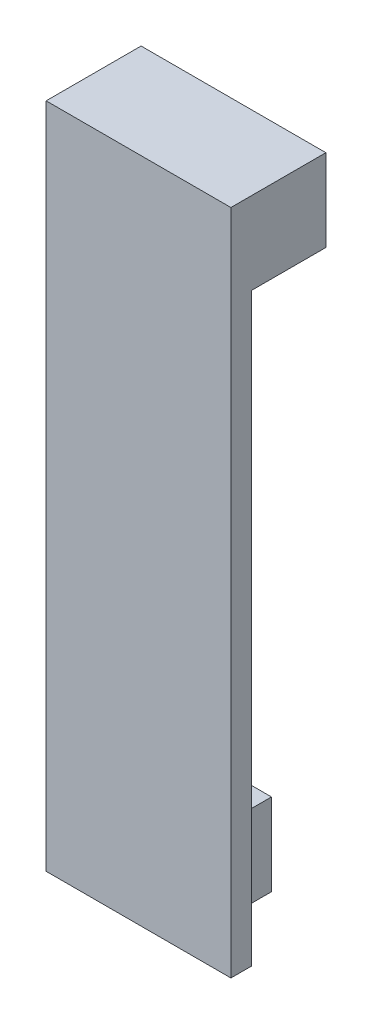
ISO-10303-21;
HEADER;
FILE_DESCRIPTION(('STEP AP214'),'2;1');
FILE_NAME('part.step','',(''),(''),'','','');
FILE_SCHEMA(('AUTOMOTIVE_DESIGN { 1 0 10303 214 1 1 1 1 }'));
ENDSEC;
DATA;
#1=APPLICATION_CONTEXT('core data for automotive mechanical design processes');
#2=APPLICATION_PROTOCOL_DEFINITION('international standard','automotive_design',2000,#1);
#3=PRODUCT_CONTEXT('',#1,'mechanical');
#4=PRODUCT('Part','Part','',(#3));
#5=PRODUCT_RELATED_PRODUCT_CATEGORY('part','',(#4));
#6=PRODUCT_DEFINITION_FORMATION('','',#4);
#7=PRODUCT_DEFINITION_CONTEXT('part definition',#1,'design');
#8=PRODUCT_DEFINITION('design','',#6,#7);
#9=PRODUCT_DEFINITION_SHAPE('','',#8);
#10=(LENGTH_UNIT() NAMED_UNIT(*) SI_UNIT(.MILLI.,.METRE.));
#11=(NAMED_UNIT(*) PLANE_ANGLE_UNIT() SI_UNIT($,.RADIAN.));
#12=(NAMED_UNIT(*) SI_UNIT($,.STERADIAN.) SOLID_ANGLE_UNIT());
#13=UNCERTAINTY_MEASURE_WITH_UNIT(LENGTH_MEASURE(1.E-05),#10,'distance_accuracy_value','');
#14=(GEOMETRIC_REPRESENTATION_CONTEXT(3) GLOBAL_UNCERTAINTY_ASSIGNED_CONTEXT((#13)) GLOBAL_UNIT_ASSIGNED_CONTEXT((#10,
#11,#12)) REPRESENTATION_CONTEXT('',''));
#15=CARTESIAN_POINT('',(0.,0.,0.));
#16=DIRECTION('',(0.,0.,1.));
#17=DIRECTION('',(1.,0.,0.));
#18=AXIS2_PLACEMENT_3D('',#15,#16,#17);
#19=CARTESIAN_POINT('',(0.,0.,0.));
#20=DIRECTION('',(0.,0.,-1.));
#21=DIRECTION('',(-1.,0.,0.));
#22=AXIS2_PLACEMENT_3D('',#19,#20,#21);
#23=PLANE('',#22);
#24=DIRECTION('',(0.,-1.,0.));
#25=VECTOR('',#24,1.);
#26=CARTESIAN_POINT('',(-9.,-32.5,0.));
#27=LINE('',#26,#25);
#28=CARTESIAN_POINT('',(-9.,24.5,0.));
#29=VERTEX_POINT('',#28);
#30=CARTESIAN_POINT('',(-9.,-32.5,0.));
#31=VERTEX_POINT('',#30);
#32=EDGE_CURVE('E342',#29,#31,#27,.T.);
#33=ORIENTED_EDGE('',*,*,#32,.F.);
#34=DIRECTION('',(-1.,0.,0.));
#35=VECTOR('',#34,1.);
#36=CARTESIAN_POINT('',(9.,24.5,0.));
#37=LINE('',#36,#35);
#38=CARTESIAN_POINT('',(9.,24.5,0.));
#39=VERTEX_POINT('',#38);
#40=EDGE_CURVE('E188',#39,#29,#37,.T.);
#41=ORIENTED_EDGE('',*,*,#40,.F.);
#42=DIRECTION('',(0.,1.,0.));
#43=VECTOR('',#42,1.);
#44=CARTESIAN_POINT('',(9.,-32.5,0.));
#45=LINE('',#44,#43);
#46=CARTESIAN_POINT('',(9.,-32.5,0.));
#47=VERTEX_POINT('',#46);
#48=EDGE_CURVE('E193',#47,#39,#45,.T.);
#49=ORIENTED_EDGE('',*,*,#48,.F.);
#50=DIRECTION('',(1.,0.,0.));
#51=VECTOR('',#50,1.);
#52=CARTESIAN_POINT('',(-9.,-32.5,0.));
#53=LINE('',#52,#51);
#54=CARTESIAN_POINT('',(3.7,-32.5,0.));
#55=VERTEX_POINT('',#54);
#56=EDGE_CURVE('E345',#55,#47,#53,.T.);
#57=ORIENTED_EDGE('',*,*,#56,.F.);
#58=DIRECTION('',(0.,-1.,0.));
#59=VECTOR('',#58,1.);
#60=CARTESIAN_POINT('',(3.7,-32.5,0.));
#61=LINE('',#60,#59);
#62=CARTESIAN_POINT('',(3.7,-24.5,0.));
#63=VERTEX_POINT('',#62);
#64=EDGE_CURVE('E238',#63,#55,#61,.T.);
#65=ORIENTED_EDGE('',*,*,#64,.F.);
#66=DIRECTION('',(1.,0.,0.));
#67=VECTOR('',#66,1.);
#68=CARTESIAN_POINT('',(3.7,-24.5,0.));
#69=LINE('',#68,#67);
#70=CARTESIAN_POINT('',(-3.7,-24.5,0.));
#71=VERTEX_POINT('',#70);
#72=EDGE_CURVE('E290',#71,#63,#69,.T.);
#73=ORIENTED_EDGE('',*,*,#72,.F.);
#74=DIRECTION('',(0.,1.,0.));
#75=VECTOR('',#74,1.);
#76=CARTESIAN_POINT('',(-3.7,-32.5,0.));
#77=LINE('',#76,#75);
#78=CARTESIAN_POINT('',(-3.7,-32.5,0.));
#79=VERTEX_POINT('',#78);
#80=EDGE_CURVE('E303',#79,#71,#77,.T.);
#81=ORIENTED_EDGE('',*,*,#80,.F.);
#82=EDGE_CURVE('E330',#31,#79,#53,.T.);
#83=ORIENTED_EDGE('',*,*,#82,.F.);
#84=EDGE_LOOP('',(#33,#41,#49,#57,#65,#73,#81,#83));
#85=FACE_BOUND('',#84,.T.);
#86=ADVANCED_FACE('F41',(#85),#23,.T.);
#87=CARTESIAN_POINT('',(9.,-32.5,2.));
#88=DIRECTION('',(-1.,0.,0.));
#89=DIRECTION('',(0.,0.,1.));
#90=AXIS2_PLACEMENT_3D('',#87,#88,#89);
#91=PLANE('',#90);
#92=ORIENTED_EDGE('',*,*,#48,.T.);
#93=DIRECTION('',(0.,0.,1.));
#94=VECTOR('',#93,1.);
#95=CARTESIAN_POINT('',(9.,24.5,-7.25));
#96=LINE('',#95,#94);
#97=CARTESIAN_POINT('',(9.,24.5,-7.25));
#98=VERTEX_POINT('',#97);
#99=EDGE_CURVE('E169',#98,#39,#96,.T.);
#100=ORIENTED_EDGE('',*,*,#99,.F.);
#101=DIRECTION('',(0.,-1.,0.));
#102=VECTOR('',#101,1.);
#103=CARTESIAN_POINT('',(9.,32.5,-7.25));
#104=LINE('',#103,#102);
#105=CARTESIAN_POINT('',(9.,32.5,-7.25));
#106=VERTEX_POINT('',#105);
#107=EDGE_CURVE('E178',#106,#98,#104,.T.);
#108=ORIENTED_EDGE('',*,*,#107,.F.);
#109=DIRECTION('',(0.,0.,-1.));
#110=VECTOR('',#109,1.);
#111=CARTESIAN_POINT('',(9.,32.5,2.));
#112=LINE('',#111,#110);
#113=CARTESIAN_POINT('',(9.,32.5,2.));
#114=VERTEX_POINT('',#113);
#115=EDGE_CURVE('E11',#114,#106,#112,.T.);
#116=ORIENTED_EDGE('',*,*,#115,.F.);
#117=DIRECTION('',(0.,1.,0.));
#118=VECTOR('',#117,1.);
#119=CARTESIAN_POINT('',(9.,-32.5,2.));
#120=LINE('',#119,#118);
#121=CARTESIAN_POINT('',(9.,-32.5,2.));
#122=VERTEX_POINT('',#121);
#123=EDGE_CURVE('E325',#122,#114,#120,.T.);
#124=ORIENTED_EDGE('',*,*,#123,.F.);
#125=DIRECTION('',(0.,0.,-1.));
#126=VECTOR('',#125,1.);
#127=CARTESIAN_POINT('',(9.,-32.5,2.));
#128=LINE('',#127,#126);
#129=EDGE_CURVE('E339',#122,#47,#128,.T.);
#130=ORIENTED_EDGE('',*,*,#129,.T.);
#131=EDGE_LOOP('',(#92,#100,#108,#116,#124,#130));
#132=FACE_BOUND('',#131,.T.);
#133=ADVANCED_FACE('F43',(#132),#91,.F.);
#134=CARTESIAN_POINT('',(-9.,32.5,2.));
#135=DIRECTION('',(0.,-1.,0.));
#136=DIRECTION('',(0.,0.,-1.));
#137=AXIS2_PLACEMENT_3D('',#134,#135,#136);
#138=PLANE('',#137);
#139=ORIENTED_EDGE('',*,*,#115,.T.);
#140=DIRECTION('',(1.,0.,0.));
#141=VECTOR('',#140,1.);
#142=CARTESIAN_POINT('',(9.,32.5,-7.25));
#143=LINE('',#142,#141);
#144=CARTESIAN_POINT('',(-9.,32.5,-7.25));
#145=VERTEX_POINT('',#144);
#146=EDGE_CURVE('E184',#145,#106,#143,.T.);
#147=ORIENTED_EDGE('',*,*,#146,.F.);
#148=DIRECTION('',(0.,0.,-1.));
#149=VECTOR('',#148,1.);
#150=CARTESIAN_POINT('',(-9.,32.5,2.));
#151=LINE('',#150,#149);
#152=CARTESIAN_POINT('',(-9.,32.5,2.));
#153=VERTEX_POINT('',#152);
#154=EDGE_CURVE('E50',#153,#145,#151,.T.);
#155=ORIENTED_EDGE('',*,*,#154,.F.);
#156=DIRECTION('',(-1.,0.,0.));
#157=VECTOR('',#156,1.);
#158=CARTESIAN_POINT('',(-9.,32.5,2.));
#159=LINE('',#158,#157);
#160=EDGE_CURVE('E329',#114,#153,#159,.T.);
#161=ORIENTED_EDGE('',*,*,#160,.F.);
#162=EDGE_LOOP('',(#139,#147,#155,#161));
#163=FACE_BOUND('',#162,.T.);
#164=ADVANCED_FACE('F363',(#163),#138,.F.);
#165=CARTESIAN_POINT('',(-9.,-32.5,2.));
#166=DIRECTION('',(1.,0.,0.));
#167=DIRECTION('',(0.,0.,-1.));
#168=AXIS2_PLACEMENT_3D('',#165,#166,#167);
#169=PLANE('',#168);
#170=ORIENTED_EDGE('',*,*,#154,.T.);
#171=DIRECTION('',(0.,1.,0.));
#172=VECTOR('',#171,1.);
#173=CARTESIAN_POINT('',(-9.,32.5,-7.25));
#174=LINE('',#173,#172);
#175=CARTESIAN_POINT('',(-9.,24.5,-7.25));
#176=VERTEX_POINT('',#175);
#177=EDGE_CURVE('E177',#176,#145,#174,.T.);
#178=ORIENTED_EDGE('',*,*,#177,.F.);
#179=DIRECTION('',(0.,0.,1.));
#180=VECTOR('',#179,1.);
#181=CARTESIAN_POINT('',(-9.,24.5,-7.25));
#182=LINE('',#181,#180);
#183=EDGE_CURVE('E172',#176,#29,#182,.T.);
#184=ORIENTED_EDGE('',*,*,#183,.T.);
#185=ORIENTED_EDGE('',*,*,#32,.T.);
#186=DIRECTION('',(0.,0.,-1.));
#187=VECTOR('',#186,1.);
#188=CARTESIAN_POINT('',(-9.,-32.5,2.));
#189=LINE('',#188,#187);
#190=CARTESIAN_POINT('',(-9.,-32.5,2.));
#191=VERTEX_POINT('',#190);
#192=EDGE_CURVE('E351',#191,#31,#189,.T.);
#193=ORIENTED_EDGE('',*,*,#192,.F.);
#194=DIRECTION('',(0.,-1.,0.));
#195=VECTOR('',#194,1.);
#196=CARTESIAN_POINT('',(-9.,-32.5,2.));
#197=LINE('',#196,#195);
#198=EDGE_CURVE('E333',#153,#191,#197,.T.);
#199=ORIENTED_EDGE('',*,*,#198,.F.);
#200=EDGE_LOOP('',(#170,#178,#184,#185,#193,#199));
#201=FACE_BOUND('',#200,.T.);
#202=ADVANCED_FACE('F358',(#201),#169,.F.);
#203=CARTESIAN_POINT('',(-9.,-32.5,2.));
#204=DIRECTION('',(0.,1.,0.));
#205=DIRECTION('',(0.,0.,1.));
#206=AXIS2_PLACEMENT_3D('',#203,#204,#205);
#207=PLANE('',#206);
#208=DIRECTION('',(1.,0.,0.));
#209=VECTOR('',#208,1.);
#210=CARTESIAN_POINT('',(-3.2,-32.5,-5.75));
#211=LINE('',#210,#209);
#212=CARTESIAN_POINT('',(-3.2,-32.5,-5.75));
#213=VERTEX_POINT('',#212);
#214=CARTESIAN_POINT('',(-0.199999999999999,-32.5,-5.75));
#215=VERTEX_POINT('',#214);
#216=EDGE_CURVE('E223',#213,#215,#211,.T.);
#217=ORIENTED_EDGE('',*,*,#216,.F.);
#218=DIRECTION('',(0.,0.,-1.));
#219=VECTOR('',#218,1.);
#220=CARTESIAN_POINT('',(-3.2,-32.5,-1.25));
#221=LINE('',#220,#219);
#222=CARTESIAN_POINT('',(-3.2,-32.5,-1.25));
#223=VERTEX_POINT('',#222);
#224=EDGE_CURVE('E57',#223,#213,#221,.T.);
#225=ORIENTED_EDGE('',*,*,#224,.F.);
#226=DIRECTION('',(-1.,0.,0.));
#227=VECTOR('',#226,1.);
#228=CARTESIAN_POINT('',(-3.2,-32.5,-1.25));
#229=LINE('',#228,#227);
#230=CARTESIAN_POINT('',(-0.2,-32.5,-1.25));
#231=VERTEX_POINT('',#230);
#232=EDGE_CURVE('E208',#231,#223,#229,.T.);
#233=ORIENTED_EDGE('',*,*,#232,.F.);
#234=DIRECTION('',(0.,0.,1.));
#235=VECTOR('',#234,1.);
#236=CARTESIAN_POINT('',(-0.2,-32.5,-1.25));
#237=LINE('',#236,#235);
#238=EDGE_CURVE('E228',#215,#231,#237,.T.);
#239=ORIENTED_EDGE('',*,*,#238,.F.);
#240=EDGE_LOOP('',(#217,#225,#233,#239));
#241=FACE_BOUND('',#240,.T.);
#242=DIRECTION('',(1.,0.,0.));
#243=VECTOR('',#242,1.);
#244=CARTESIAN_POINT('',(0.2,-32.5,-5.75));
#245=LINE('',#244,#243);
#246=CARTESIAN_POINT('',(0.200000000000001,-32.5,-5.75));
#247=VERTEX_POINT('',#246);
#248=CARTESIAN_POINT('',(3.2,-32.5,-5.75));
#249=VERTEX_POINT('',#248);
#250=EDGE_CURVE('E198',#247,#249,#245,.T.);
#251=ORIENTED_EDGE('',*,*,#250,.F.);
#252=DIRECTION('',(0.,0.,-1.));
#253=VECTOR('',#252,1.);
#254=CARTESIAN_POINT('',(0.2,-32.5,-1.25));
#255=LINE('',#254,#253);
#256=CARTESIAN_POINT('',(0.2,-32.5,-1.25));
#257=VERTEX_POINT('',#256);
#258=EDGE_CURVE('E65',#257,#247,#255,.T.);
#259=ORIENTED_EDGE('',*,*,#258,.F.);
#260=DIRECTION('',(-1.,0.,0.));
#261=VECTOR('',#260,1.);
#262=CARTESIAN_POINT('',(0.2,-32.5,-1.25));
#263=LINE('',#262,#261);
#264=CARTESIAN_POINT('',(3.2,-32.5,-1.25));
#265=VERTEX_POINT('',#264);
#266=EDGE_CURVE('E252',#265,#257,#263,.T.);
#267=ORIENTED_EDGE('',*,*,#266,.F.);
#268=DIRECTION('',(0.,0.,1.));
#269=VECTOR('',#268,1.);
#270=CARTESIAN_POINT('',(3.2,-32.5,-1.25));
#271=LINE('',#270,#269);
#272=EDGE_CURVE('E268',#249,#265,#271,.T.);
#273=ORIENTED_EDGE('',*,*,#272,.F.);
#274=EDGE_LOOP('',(#251,#259,#267,#273));
#275=FACE_BOUND('',#274,.T.);
#276=ORIENTED_EDGE('',*,*,#82,.T.);
#277=DIRECTION('',(0.,0.,1.));
#278=VECTOR('',#277,1.);
#279=CARTESIAN_POINT('',(-3.7,-32.5,-7.25));
#280=LINE('',#279,#278);
#281=CARTESIAN_POINT('',(-3.7,-32.5,-7.25));
#282=VERTEX_POINT('',#281);
#283=EDGE_CURVE('E317',#282,#79,#280,.T.);
#284=ORIENTED_EDGE('',*,*,#283,.F.);
#285=DIRECTION('',(-1.,0.,0.));
#286=VECTOR('',#285,1.);
#287=CARTESIAN_POINT('',(3.7,-32.5,-7.25));
#288=LINE('',#287,#286);
#289=CARTESIAN_POINT('',(3.7,-32.5,-7.25));
#290=VERTEX_POINT('',#289);
#291=EDGE_CURVE('E289',#290,#282,#288,.T.);
#292=ORIENTED_EDGE('',*,*,#291,.F.);
#293=DIRECTION('',(0.,0.,1.));
#294=VECTOR('',#293,1.);
#295=CARTESIAN_POINT('',(3.7,-32.5,-7.25));
#296=LINE('',#295,#294);
#297=EDGE_CURVE('E321',#290,#55,#296,.T.);
#298=ORIENTED_EDGE('',*,*,#297,.T.);
#299=ORIENTED_EDGE('',*,*,#56,.T.);
#300=ORIENTED_EDGE('',*,*,#129,.F.);
#301=DIRECTION('',(1.,0.,0.));
#302=VECTOR('',#301,1.);
#303=CARTESIAN_POINT('',(-9.,-32.5,2.));
#304=LINE('',#303,#302);
#305=EDGE_CURVE('E336',#191,#122,#304,.T.);
#306=ORIENTED_EDGE('',*,*,#305,.F.);
#307=ORIENTED_EDGE('',*,*,#192,.T.);
#308=EDGE_LOOP('',(#276,#284,#292,#298,#299,#300,#306,#307));
#309=FACE_BOUND('',#308,.T.);
#310=ADVANCED_FACE('F372',(#241,#275,#309),#207,.F.);
#311=CARTESIAN_POINT('',(0.,0.,2.));
#312=DIRECTION('',(0.,0.,-1.));
#313=DIRECTION('',(-1.,0.,0.));
#314=AXIS2_PLACEMENT_3D('',#311,#312,#313);
#315=PLANE('',#314);
#316=ORIENTED_EDGE('',*,*,#123,.T.);
#317=ORIENTED_EDGE('',*,*,#160,.T.);
#318=ORIENTED_EDGE('',*,*,#198,.T.);
#319=ORIENTED_EDGE('',*,*,#305,.T.);
#320=EDGE_LOOP('',(#316,#317,#318,#319));
#321=FACE_BOUND('',#320,.T.);
#322=ADVANCED_FACE('F405',(#321),#315,.F.);
#323=CARTESIAN_POINT('',(3.7,-32.5,-7.25));
#324=DIRECTION('',(-1.,0.,0.));
#325=DIRECTION('',(0.,-1.,0.));
#326=AXIS2_PLACEMENT_3D('',#323,#324,#325);
#327=PLANE('',#326);
#328=ORIENTED_EDGE('',*,*,#64,.T.);
#329=ORIENTED_EDGE('',*,*,#297,.F.);
#330=DIRECTION('',(0.,-1.,0.));
#331=VECTOR('',#330,1.);
#332=CARTESIAN_POINT('',(3.7,-32.5,-7.25));
#333=LINE('',#332,#331);
#334=CARTESIAN_POINT('',(3.7,-24.5,-7.25));
#335=VERTEX_POINT('',#334);
#336=EDGE_CURVE('E285',#335,#290,#333,.T.);
#337=ORIENTED_EDGE('',*,*,#336,.F.);
#338=DIRECTION('',(0.,0.,1.));
#339=VECTOR('',#338,1.);
#340=CARTESIAN_POINT('',(3.7,-24.5,-7.25));
#341=LINE('',#340,#339);
#342=EDGE_CURVE('E299',#335,#63,#341,.T.);
#343=ORIENTED_EDGE('',*,*,#342,.T.);
#344=EDGE_LOOP('',(#328,#329,#337,#343));
#345=FACE_BOUND('',#344,.T.);
#346=ADVANCED_FACE('F386',(#345),#327,.F.);
#347=CARTESIAN_POINT('',(-3.7,-32.5,-7.25));
#348=DIRECTION('',(1.,0.,0.));
#349=DIRECTION('',(0.,0.,-1.));
#350=AXIS2_PLACEMENT_3D('',#347,#348,#349);
#351=PLANE('',#350);
#352=ORIENTED_EDGE('',*,*,#80,.T.);
#353=DIRECTION('',(0.,0.,1.));
#354=VECTOR('',#353,1.);
#355=CARTESIAN_POINT('',(-3.7,-24.5,-7.25));
#356=LINE('',#355,#354);
#357=CARTESIAN_POINT('',(-3.7,-24.5,-7.25));
#358=VERTEX_POINT('',#357);
#359=EDGE_CURVE('E313',#358,#71,#356,.T.);
#360=ORIENTED_EDGE('',*,*,#359,.F.);
#361=DIRECTION('',(0.,1.,0.));
#362=VECTOR('',#361,1.);
#363=CARTESIAN_POINT('',(-3.7,-32.5,-7.25));
#364=LINE('',#363,#362);
#365=EDGE_CURVE('E293',#282,#358,#364,.T.);
#366=ORIENTED_EDGE('',*,*,#365,.F.);
#367=ORIENTED_EDGE('',*,*,#283,.T.);
#368=EDGE_LOOP('',(#352,#360,#366,#367));
#369=FACE_BOUND('',#368,.T.);
#370=ADVANCED_FACE('F376',(#369),#351,.F.);
#371=CARTESIAN_POINT('',(3.7,-24.5,-7.25));
#372=DIRECTION('',(0.,-1.,0.));
#373=DIRECTION('',(0.,0.,-1.));
#374=AXIS2_PLACEMENT_3D('',#371,#372,#373);
#375=PLANE('',#374);
#376=ORIENTED_EDGE('',*,*,#72,.T.);
#377=ORIENTED_EDGE('',*,*,#342,.F.);
#378=DIRECTION('',(1.,0.,0.));
#379=VECTOR('',#378,1.);
#380=CARTESIAN_POINT('',(3.7,-24.5,-7.25));
#381=LINE('',#380,#379);
#382=EDGE_CURVE('E296',#358,#335,#381,.T.);
#383=ORIENTED_EDGE('',*,*,#382,.F.);
#384=ORIENTED_EDGE('',*,*,#359,.T.);
#385=EDGE_LOOP('',(#376,#377,#383,#384));
#386=FACE_BOUND('',#385,.T.);
#387=ADVANCED_FACE('F388',(#386),#375,.F.);
#388=CARTESIAN_POINT('',(0.,0.,-7.25));
#389=DIRECTION('',(0.,0.,1.));
#390=DIRECTION('',(1.,0.,0.));
#391=AXIS2_PLACEMENT_3D('',#388,#389,#390);
#392=PLANE('',#391);
#393=ORIENTED_EDGE('',*,*,#336,.T.);
#394=ORIENTED_EDGE('',*,*,#291,.T.);
#395=ORIENTED_EDGE('',*,*,#365,.T.);
#396=ORIENTED_EDGE('',*,*,#382,.T.);
#397=EDGE_LOOP('',(#393,#394,#395,#396));
#398=FACE_BOUND('',#397,.T.);
#399=ADVANCED_FACE('F380',(#398),#392,.F.);
#400=CARTESIAN_POINT('',(0.2,-27.5,-1.25));
#401=DIRECTION('',(-1.,0.,0.));
#402=DIRECTION('',(0.,0.,1.));
#403=AXIS2_PLACEMENT_3D('',#400,#401,#402);
#404=PLANE('',#403);
#405=ORIENTED_EDGE('',*,*,#258,.T.);
#406=DIRECTION('',(0.,-1.,0.));
#407=VECTOR('',#406,1.);
#408=CARTESIAN_POINT('',(0.2,-27.5,-5.75));
#409=LINE('',#408,#407);
#410=CARTESIAN_POINT('',(0.2,-27.5,-5.75));
#411=VERTEX_POINT('',#410);
#412=EDGE_CURVE('E263',#411,#247,#409,.T.);
#413=ORIENTED_EDGE('',*,*,#412,.F.);
#414=DIRECTION('',(0.,0.,-1.));
#415=VECTOR('',#414,1.);
#416=CARTESIAN_POINT('',(0.2,-27.5,-1.25));
#417=LINE('',#416,#415);
#418=CARTESIAN_POINT('',(0.2,-27.5,-1.25));
#419=VERTEX_POINT('',#418);
#420=EDGE_CURVE('E247',#419,#411,#417,.T.);
#421=ORIENTED_EDGE('',*,*,#420,.F.);
#422=DIRECTION('',(0.,-1.,0.));
#423=VECTOR('',#422,1.);
#424=CARTESIAN_POINT('',(0.2,-27.5,-1.25));
#425=LINE('',#424,#423);
#426=EDGE_CURVE('E224',#419,#257,#425,.T.);
#427=ORIENTED_EDGE('',*,*,#426,.T.);
#428=EDGE_LOOP('',(#405,#413,#421,#427));
#429=FACE_BOUND('',#428,.T.);
#430=ADVANCED_FACE('F395',(#429),#404,.F.);
#431=CARTESIAN_POINT('',(0.2,-27.5,-1.25));
#432=DIRECTION('',(0.,0.,1.));
#433=DIRECTION('',(1.,0.,0.));
#434=AXIS2_PLACEMENT_3D('',#431,#432,#433);
#435=PLANE('',#434);
#436=ORIENTED_EDGE('',*,*,#266,.T.);
#437=ORIENTED_EDGE('',*,*,#426,.F.);
#438=DIRECTION('',(-1.,0.,0.));
#439=VECTOR('',#438,1.);
#440=CARTESIAN_POINT('',(0.2,-27.5,-1.25));
#441=LINE('',#440,#439);
#442=CARTESIAN_POINT('',(3.2,-27.5,-1.25));
#443=VERTEX_POINT('',#442);
#444=EDGE_CURVE('E260',#443,#419,#441,.T.);
#445=ORIENTED_EDGE('',*,*,#444,.F.);
#446=DIRECTION('',(0.,-1.,0.));
#447=VECTOR('',#446,1.);
#448=CARTESIAN_POINT('',(3.2,-27.5,-1.25));
#449=LINE('',#448,#447);
#450=EDGE_CURVE('E277',#443,#265,#449,.T.);
#451=ORIENTED_EDGE('',*,*,#450,.T.);
#452=EDGE_LOOP('',(#436,#437,#445,#451));
#453=FACE_BOUND('',#452,.T.);
#454=ADVANCED_FACE('F513',(#453),#435,.F.);
#455=CARTESIAN_POINT('',(3.2,-27.5,-1.25));
#456=DIRECTION('',(1.,0.,0.));
#457=DIRECTION('',(0.,0.,-1.));
#458=AXIS2_PLACEMENT_3D('',#455,#456,#457);
#459=PLANE('',#458);
#460=ORIENTED_EDGE('',*,*,#272,.T.);
#461=ORIENTED_EDGE('',*,*,#450,.F.);
#462=DIRECTION('',(0.,0.,1.));
#463=VECTOR('',#462,1.);
#464=CARTESIAN_POINT('',(3.2,-27.5,-1.25));
#465=LINE('',#464,#463);
#466=CARTESIAN_POINT('',(3.2,-27.5,-5.75));
#467=VERTEX_POINT('',#466);
#468=EDGE_CURVE('E256',#467,#443,#465,.T.);
#469=ORIENTED_EDGE('',*,*,#468,.F.);
#470=DIRECTION('',(0.,-1.,0.));
#471=VECTOR('',#470,1.);
#472=CARTESIAN_POINT('',(3.2,-27.5,-5.75));
#473=LINE('',#472,#471);
#474=EDGE_CURVE('E280',#467,#249,#473,.T.);
#475=ORIENTED_EDGE('',*,*,#474,.T.);
#476=EDGE_LOOP('',(#460,#461,#469,#475));
#477=FACE_BOUND('',#476,.T.);
#478=ADVANCED_FACE('F458',(#477),#459,.F.);
#479=CARTESIAN_POINT('',(0.2,-27.5,-5.75));
#480=DIRECTION('',(0.,0.,-1.));
#481=DIRECTION('',(-1.,0.,0.));
#482=AXIS2_PLACEMENT_3D('',#479,#480,#481);
#483=PLANE('',#482);
#484=ORIENTED_EDGE('',*,*,#250,.T.);
#485=ORIENTED_EDGE('',*,*,#474,.F.);
#486=DIRECTION('',(1.,0.,0.));
#487=VECTOR('',#486,1.);
#488=CARTESIAN_POINT('',(0.2,-27.5,-5.75));
#489=LINE('',#488,#487);
#490=EDGE_CURVE('E251',#411,#467,#489,.T.);
#491=ORIENTED_EDGE('',*,*,#490,.F.);
#492=ORIENTED_EDGE('',*,*,#412,.T.);
#493=EDGE_LOOP('',(#484,#485,#491,#492));
#494=FACE_BOUND('',#493,.T.);
#495=ADVANCED_FACE('F452',(#494),#483,.F.);
#496=CARTESIAN_POINT('',(0.,-27.5,0.));
#497=DIRECTION('',(0.,-1.,0.));
#498=DIRECTION('',(0.,0.,-1.));
#499=AXIS2_PLACEMENT_3D('',#496,#497,#498);
#500=PLANE('',#499);
#501=ORIENTED_EDGE('',*,*,#420,.T.);
#502=ORIENTED_EDGE('',*,*,#490,.T.);
#503=ORIENTED_EDGE('',*,*,#468,.T.);
#504=ORIENTED_EDGE('',*,*,#444,.T.);
#505=EDGE_LOOP('',(#501,#502,#503,#504));
#506=FACE_BOUND('',#505,.T.);
#507=ADVANCED_FACE('F457',(#506),#500,.T.);
#508=CARTESIAN_POINT('',(-3.2,-27.5,-1.25));
#509=DIRECTION('',(-1.,0.,0.));
#510=DIRECTION('',(0.,0.,1.));
#511=AXIS2_PLACEMENT_3D('',#508,#509,#510);
#512=PLANE('',#511);
#513=ORIENTED_EDGE('',*,*,#224,.T.);
#514=DIRECTION('',(0.,-1.,0.));
#515=VECTOR('',#514,1.);
#516=CARTESIAN_POINT('',(-3.2,-27.5,-5.75));
#517=LINE('',#516,#515);
#518=CARTESIAN_POINT('',(-3.2,-27.5,-5.75));
#519=VERTEX_POINT('',#518);
#520=EDGE_CURVE('E220',#519,#213,#517,.T.);
#521=ORIENTED_EDGE('',*,*,#520,.F.);
#522=DIRECTION('',(0.,0.,-1.));
#523=VECTOR('',#522,1.);
#524=CARTESIAN_POINT('',(-3.2,-27.5,-1.25));
#525=LINE('',#524,#523);
#526=CARTESIAN_POINT('',(-3.2,-27.5,-1.25));
#527=VERTEX_POINT('',#526);
#528=EDGE_CURVE('E203',#527,#519,#525,.T.);
#529=ORIENTED_EDGE('',*,*,#528,.F.);
#530=DIRECTION('',(0.,-1.,0.));
#531=VECTOR('',#530,1.);
#532=CARTESIAN_POINT('',(-3.2,-27.5,-1.25));
#533=LINE('',#532,#531);
#534=EDGE_CURVE('E235',#527,#223,#533,.T.);
#535=ORIENTED_EDGE('',*,*,#534,.T.);
#536=EDGE_LOOP('',(#513,#521,#529,#535));
#537=FACE_BOUND('',#536,.T.);
#538=ADVANCED_FACE('F498',(#537),#512,.F.);
#539=CARTESIAN_POINT('',(-3.2,-27.5,-1.25));
#540=DIRECTION('',(0.,0.,1.));
#541=DIRECTION('',(1.,0.,0.));
#542=AXIS2_PLACEMENT_3D('',#539,#540,#541);
#543=PLANE('',#542);
#544=ORIENTED_EDGE('',*,*,#232,.T.);
#545=ORIENTED_EDGE('',*,*,#534,.F.);
#546=DIRECTION('',(-1.,0.,0.));
#547=VECTOR('',#546,1.);
#548=CARTESIAN_POINT('',(-3.2,-27.5,-1.25));
#549=LINE('',#548,#547);
#550=CARTESIAN_POINT('',(-0.2,-27.5,-1.25));
#551=VERTEX_POINT('',#550);
#552=EDGE_CURVE('E216',#551,#527,#549,.T.);
#553=ORIENTED_EDGE('',*,*,#552,.F.);
#554=DIRECTION('',(0.,-1.,0.));
#555=VECTOR('',#554,1.);
#556=CARTESIAN_POINT('',(-0.2,-27.5,-1.25));
#557=LINE('',#556,#555);
#558=EDGE_CURVE('E239',#551,#231,#557,.T.);
#559=ORIENTED_EDGE('',*,*,#558,.T.);
#560=EDGE_LOOP('',(#544,#545,#553,#559));
#561=FACE_BOUND('',#560,.T.);
#562=ADVANCED_FACE('F493',(#561),#543,.F.);
#563=CARTESIAN_POINT('',(-0.2,-27.5,-1.25));
#564=DIRECTION('',(1.,0.,0.));
#565=DIRECTION('',(0.,0.,-1.));
#566=AXIS2_PLACEMENT_3D('',#563,#564,#565);
#567=PLANE('',#566);
#568=ORIENTED_EDGE('',*,*,#238,.T.);
#569=ORIENTED_EDGE('',*,*,#558,.F.);
#570=DIRECTION('',(0.,0.,1.));
#571=VECTOR('',#570,1.);
#572=CARTESIAN_POINT('',(-0.2,-27.5,-1.25));
#573=LINE('',#572,#571);
#574=CARTESIAN_POINT('',(-0.199999999999999,-27.5,-5.75));
#575=VERTEX_POINT('',#574);
#576=EDGE_CURVE('E212',#575,#551,#573,.T.);
#577=ORIENTED_EDGE('',*,*,#576,.F.);
#578=DIRECTION('',(0.,-1.,0.));
#579=VECTOR('',#578,1.);
#580=CARTESIAN_POINT('',(-0.199999999999999,-27.5,-5.75));
#581=LINE('',#580,#579);
#582=EDGE_CURVE('E242',#575,#215,#581,.T.);
#583=ORIENTED_EDGE('',*,*,#582,.T.);
#584=EDGE_LOOP('',(#568,#569,#577,#583));
#585=FACE_BOUND('',#584,.T.);
#586=ADVANCED_FACE('F474',(#585),#567,.F.);
#587=CARTESIAN_POINT('',(-3.2,-27.5,-5.75));
#588=DIRECTION('',(0.,0.,-1.));
#589=DIRECTION('',(-1.,0.,0.));
#590=AXIS2_PLACEMENT_3D('',#587,#588,#589);
#591=PLANE('',#590);
#592=ORIENTED_EDGE('',*,*,#216,.T.);
#593=ORIENTED_EDGE('',*,*,#582,.F.);
#594=DIRECTION('',(1.,0.,0.));
#595=VECTOR('',#594,1.);
#596=CARTESIAN_POINT('',(-3.2,-27.5,-5.75));
#597=LINE('',#596,#595);
#598=EDGE_CURVE('E207',#519,#575,#597,.T.);
#599=ORIENTED_EDGE('',*,*,#598,.F.);
#600=ORIENTED_EDGE('',*,*,#520,.T.);
#601=EDGE_LOOP('',(#592,#593,#599,#600));
#602=FACE_BOUND('',#601,.T.);
#603=ADVANCED_FACE('F468',(#602),#591,.F.);
#604=CARTESIAN_POINT('',(0.,-27.5,0.));
#605=DIRECTION('',(0.,-1.,0.));
#606=DIRECTION('',(0.,0.,-1.));
#607=AXIS2_PLACEMENT_3D('',#604,#605,#606);
#608=PLANE('',#607);
#609=ORIENTED_EDGE('',*,*,#528,.T.);
#610=ORIENTED_EDGE('',*,*,#598,.T.);
#611=ORIENTED_EDGE('',*,*,#576,.T.);
#612=ORIENTED_EDGE('',*,*,#552,.T.);
#613=EDGE_LOOP('',(#609,#610,#611,#612));
#614=FACE_BOUND('',#613,.T.);
#615=ADVANCED_FACE('F473',(#614),#608,.T.);
#616=CARTESIAN_POINT('',(9.,24.5,-7.25));
#617=DIRECTION('',(0.,1.,0.));
#618=DIRECTION('',(0.,0.,1.));
#619=AXIS2_PLACEMENT_3D('',#616,#617,#618);
#620=PLANE('',#619);
#621=ORIENTED_EDGE('',*,*,#40,.T.);
#622=ORIENTED_EDGE('',*,*,#183,.F.);
#623=DIRECTION('',(-1.,0.,0.));
#624=VECTOR('',#623,1.);
#625=CARTESIAN_POINT('',(9.,24.5,-7.25));
#626=LINE('',#625,#624);
#627=EDGE_CURVE('E165',#98,#176,#626,.T.);
#628=ORIENTED_EDGE('',*,*,#627,.F.);
#629=ORIENTED_EDGE('',*,*,#99,.T.);
#630=EDGE_LOOP('',(#621,#622,#628,#629));
#631=FACE_BOUND('',#630,.T.);
#632=ADVANCED_FACE('F167',(#631),#620,.F.);
#633=CARTESIAN_POINT('',(0.,0.,-7.25));
#634=DIRECTION('',(0.,0.,-1.));
#635=DIRECTION('',(-1.,0.,0.));
#636=AXIS2_PLACEMENT_3D('',#633,#634,#635);
#637=PLANE('',#636);
#638=ORIENTED_EDGE('',*,*,#107,.T.);
#639=ORIENTED_EDGE('',*,*,#627,.T.);
#640=ORIENTED_EDGE('',*,*,#177,.T.);
#641=ORIENTED_EDGE('',*,*,#146,.T.);
#642=EDGE_LOOP('',(#638,#639,#640,#641));
#643=FACE_BOUND('',#642,.T.);
#644=ADVANCED_FACE('F182',(#643),#637,.T.);
#645=CLOSED_SHELL('',(#86,#133,#164,#202,#310,#322,#346,#370,#387,#399,#430,#454,#478,#495,#507,
#538,#562,#586,#603,#615,#632,#644));
#646=MANIFOLD_SOLID_BREP('B2',#645);
#647=ADVANCED_BREP_SHAPE_REPRESENTATION('',(#18,#646),#14);
#648=SHAPE_DEFINITION_REPRESENTATION(#9,#647);
ENDSEC;
END-ISO-10303-21;
